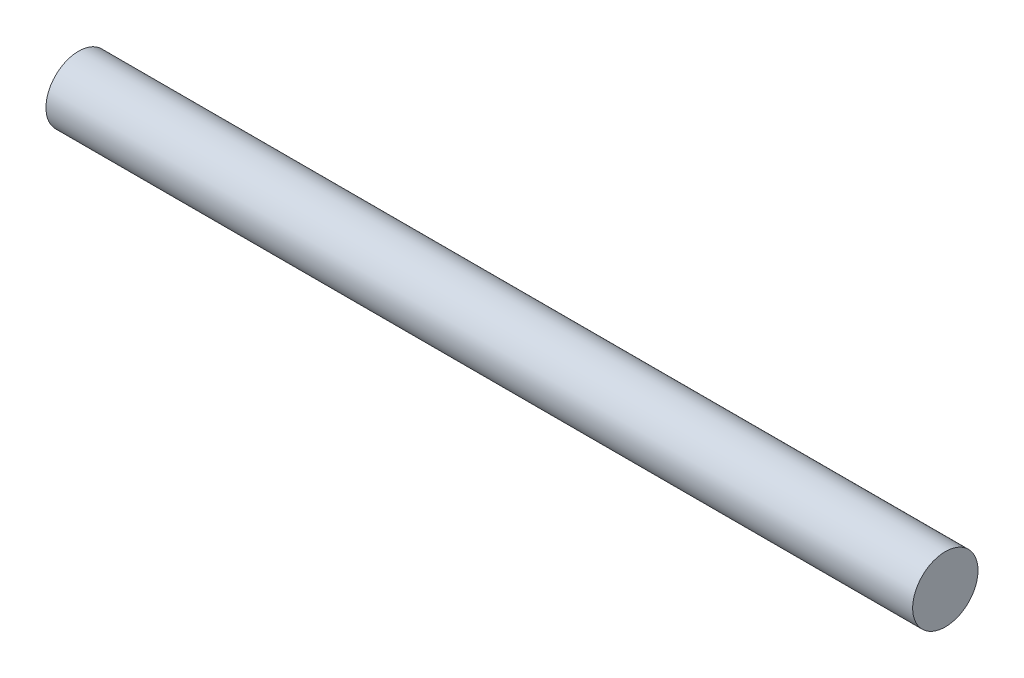
ISO-10303-21;
HEADER;
FILE_DESCRIPTION(('STEP AP214'),'2;1');
FILE_NAME('part.step','',(''),(''),'','','');
FILE_SCHEMA(('AUTOMOTIVE_DESIGN { 1 0 10303 214 1 1 1 1 }'));
ENDSEC;
DATA;
#1=APPLICATION_CONTEXT('core data for automotive mechanical design processes');
#2=APPLICATION_PROTOCOL_DEFINITION('international standard','automotive_design',2000,#1);
#3=PRODUCT_CONTEXT('',#1,'mechanical');
#4=PRODUCT('Part','Part','',(#3));
#5=PRODUCT_RELATED_PRODUCT_CATEGORY('part','',(#4));
#6=PRODUCT_DEFINITION_FORMATION('','',#4);
#7=PRODUCT_DEFINITION_CONTEXT('part definition',#1,'design');
#8=PRODUCT_DEFINITION('design','',#6,#7);
#9=PRODUCT_DEFINITION_SHAPE('','',#8);
#10=(LENGTH_UNIT() NAMED_UNIT(*) SI_UNIT(.MILLI.,.METRE.));
#11=(NAMED_UNIT(*) PLANE_ANGLE_UNIT() SI_UNIT($,.RADIAN.));
#12=(NAMED_UNIT(*) SI_UNIT($,.STERADIAN.) SOLID_ANGLE_UNIT());
#13=UNCERTAINTY_MEASURE_WITH_UNIT(LENGTH_MEASURE(1.E-05),#10,'distance_accuracy_value','');
#14=(GEOMETRIC_REPRESENTATION_CONTEXT(3) GLOBAL_UNCERTAINTY_ASSIGNED_CONTEXT((#13)) GLOBAL_UNIT_ASSIGNED_CONTEXT((#10,
#11,#12)) REPRESENTATION_CONTEXT('',''));
#15=CARTESIAN_POINT('',(0.,0.,0.));
#16=DIRECTION('',(0.,0.,1.));
#17=DIRECTION('',(1.,0.,0.));
#18=AXIS2_PLACEMENT_3D('',#15,#16,#17);
#19=CARTESIAN_POINT('',(505.54,0.,0.));
#20=DIRECTION('',(-1.,0.,0.));
#21=DIRECTION('',(0.,0.,1.));
#22=AXIS2_PLACEMENT_3D('',#19,#20,#21);
#23=CYLINDRICAL_SURFACE('',#22,19.05);
#24=CARTESIAN_POINT('',(505.54,0.,0.));
#25=DIRECTION('',(1.,0.,0.));
#26=DIRECTION('',(0.,0.,-1.));
#27=AXIS2_PLACEMENT_3D('',#24,#25,#26);
#28=CIRCLE('',#27,19.05);
#29=CARTESIAN_POINT('',(505.54,0.,-19.05));
#30=VERTEX_POINT('',#29);
#31=EDGE_CURVE('E10',#30,#30,#28,.T.);
#32=ORIENTED_EDGE('',*,*,#31,.F.);
#33=EDGE_LOOP('',(#32));
#34=FACE_BOUND('',#33,.T.);
#35=CARTESIAN_POINT('',(0.,0.,0.));
#36=DIRECTION('',(1.,0.,0.));
#37=DIRECTION('',(0.,0.,-1.));
#38=AXIS2_PLACEMENT_3D('',#35,#36,#37);
#39=CIRCLE('',#38,19.05);
#40=CARTESIAN_POINT('',(0.,0.,-19.05));
#41=VERTEX_POINT('',#40);
#42=EDGE_CURVE('E40',#41,#41,#39,.T.);
#43=ORIENTED_EDGE('',*,*,#42,.T.);
#44=EDGE_LOOP('',(#43));
#45=FACE_BOUND('',#44,.T.);
#46=ADVANCED_FACE('F37',(#34,#45),#23,.T.);
#47=CARTESIAN_POINT('',(505.54,0.,0.));
#48=DIRECTION('',(1.,0.,0.));
#49=DIRECTION('',(0.,0.,-1.));
#50=AXIS2_PLACEMENT_3D('',#47,#48,#49);
#51=PLANE('',#50);
#52=ORIENTED_EDGE('',*,*,#31,.T.);
#53=EDGE_LOOP('',(#52));
#54=FACE_BOUND('',#53,.T.);
#55=ADVANCED_FACE('F54',(#54),#51,.T.);
#56=CARTESIAN_POINT('',(0.,0.,0.));
#57=DIRECTION('',(1.,0.,0.));
#58=DIRECTION('',(0.,0.,-1.));
#59=AXIS2_PLACEMENT_3D('',#56,#57,#58);
#60=PLANE('',#59);
#61=ORIENTED_EDGE('',*,*,#42,.F.);
#62=EDGE_LOOP('',(#61));
#63=FACE_BOUND('',#62,.T.);
#64=ADVANCED_FACE('F52',(#63),#60,.F.);
#65=CLOSED_SHELL('',(#46,#55,#64));
#66=MANIFOLD_SOLID_BREP('B2',#65);
#67=ADVANCED_BREP_SHAPE_REPRESENTATION('',(#18,#66),#14);
#68=SHAPE_DEFINITION_REPRESENTATION(#9,#67);
ENDSEC;
END-ISO-10303-21;
